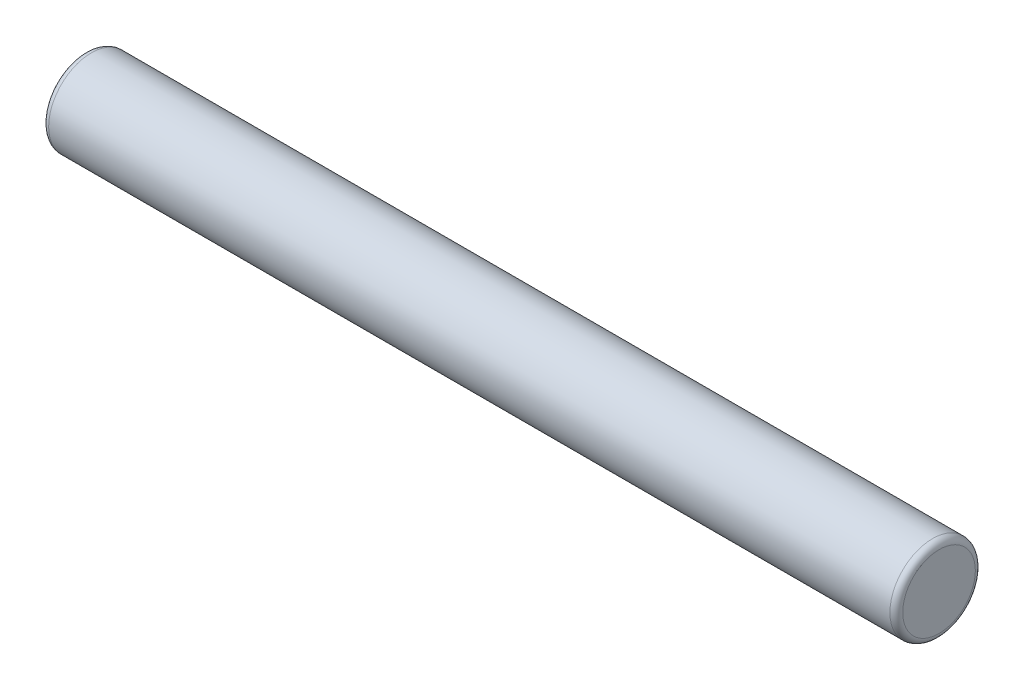
ISO-10303-21;
HEADER;
FILE_DESCRIPTION(('STEP AP214'),'2;1');
FILE_NAME('part.step','',(''),(''),'','','');
FILE_SCHEMA(('AUTOMOTIVE_DESIGN { 1 0 10303 214 1 1 1 1 }'));
ENDSEC;
DATA;
#1=APPLICATION_CONTEXT('core data for automotive mechanical design processes');
#2=APPLICATION_PROTOCOL_DEFINITION('international standard','automotive_design',2000,#1);
#3=PRODUCT_CONTEXT('',#1,'mechanical');
#4=PRODUCT('Part','Part','',(#3));
#5=PRODUCT_RELATED_PRODUCT_CATEGORY('part','',(#4));
#6=PRODUCT_DEFINITION_FORMATION('','',#4);
#7=PRODUCT_DEFINITION_CONTEXT('part definition',#1,'design');
#8=PRODUCT_DEFINITION('design','',#6,#7);
#9=PRODUCT_DEFINITION_SHAPE('','',#8);
#10=(LENGTH_UNIT() NAMED_UNIT(*) SI_UNIT(.MILLI.,.METRE.));
#11=(NAMED_UNIT(*) PLANE_ANGLE_UNIT() SI_UNIT($,.RADIAN.));
#12=(NAMED_UNIT(*) SI_UNIT($,.STERADIAN.) SOLID_ANGLE_UNIT());
#13=UNCERTAINTY_MEASURE_WITH_UNIT(LENGTH_MEASURE(1.E-05),#10,'distance_accuracy_value','');
#14=(GEOMETRIC_REPRESENTATION_CONTEXT(3) GLOBAL_UNCERTAINTY_ASSIGNED_CONTEXT((#13)) GLOBAL_UNIT_ASSIGNED_CONTEXT((#10,
#11,#12)) REPRESENTATION_CONTEXT('',''));
#15=CARTESIAN_POINT('',(0.,0.,0.));
#16=DIRECTION('',(0.,0.,1.));
#17=DIRECTION('',(1.,0.,0.));
#18=AXIS2_PLACEMENT_3D('',#15,#16,#17);
#19=CARTESIAN_POINT('',(0.,0.,0.));
#20=DIRECTION('',(-1.,0.,0.));
#21=DIRECTION('',(0.,0.,1.));
#22=AXIS2_PLACEMENT_3D('',#19,#20,#21);
#23=PLANE('',#22);
#24=CARTESIAN_POINT('',(0.,2.,0.));
#25=DIRECTION('',(-1.,0.,0.));
#26=DIRECTION('',(0.,0.,1.));
#27=AXIS2_PLACEMENT_3D('',#24,#25,#26);
#28=CIRCLE('',#27,1.7);
#29=CARTESIAN_POINT('',(0.,2.,1.7));
#30=VERTEX_POINT('',#29);
#31=EDGE_CURVE('E46',#30,#30,#28,.T.);
#32=ORIENTED_EDGE('',*,*,#31,.T.);
#33=EDGE_LOOP('',(#32));
#34=FACE_BOUND('',#33,.T.);
#35=ADVANCED_FACE('F31',(#34),#23,.T.);
#36=CARTESIAN_POINT('',(40.,0.,0.));
#37=DIRECTION('',(1.,0.,0.));
#38=DIRECTION('',(0.,0.,-1.));
#39=AXIS2_PLACEMENT_3D('',#36,#37,#38);
#40=PLANE('',#39);
#41=CARTESIAN_POINT('',(40.,2.,0.));
#42=DIRECTION('',(1.,0.,0.));
#43=DIRECTION('',(0.,0.,-1.));
#44=AXIS2_PLACEMENT_3D('',#41,#42,#43);
#45=CIRCLE('',#44,1.7);
#46=CARTESIAN_POINT('',(40.,2.,-1.7));
#47=VERTEX_POINT('',#46);
#48=EDGE_CURVE('E10',#47,#47,#45,.T.);
#49=ORIENTED_EDGE('',*,*,#48,.T.);
#50=EDGE_LOOP('',(#49));
#51=FACE_BOUND('',#50,.T.);
#52=ADVANCED_FACE('F62',(#51),#40,.T.);
#53=CARTESIAN_POINT('',(0.,2.,0.));
#54=DIRECTION('',(-1.,0.,0.));
#55=DIRECTION('',(0.,0.,1.));
#56=AXIS2_PLACEMENT_3D('',#53,#54,#55);
#57=CYLINDRICAL_SURFACE('',#56,2.);
#58=CARTESIAN_POINT('',(0.3,2.,0.));
#59=DIRECTION('',(-1.,0.,0.));
#60=DIRECTION('',(0.,0.,1.));
#61=AXIS2_PLACEMENT_3D('',#58,#59,#60);
#62=CIRCLE('',#61,2.);
#63=CARTESIAN_POINT('',(0.3,2.,2.));
#64=VERTEX_POINT('',#63);
#65=EDGE_CURVE('E38',#64,#64,#62,.F.);
#66=ORIENTED_EDGE('',*,*,#65,.T.);
#67=EDGE_LOOP('',(#66));
#68=FACE_BOUND('',#67,.T.);
#69=CARTESIAN_POINT('',(39.7,2.,0.));
#70=DIRECTION('',(1.,0.,0.));
#71=DIRECTION('',(0.,0.,-1.));
#72=AXIS2_PLACEMENT_3D('',#69,#70,#71);
#73=CIRCLE('',#72,2.);
#74=CARTESIAN_POINT('',(39.7,2.,-2.));
#75=VERTEX_POINT('',#74);
#76=EDGE_CURVE('E42',#75,#75,#73,.F.);
#77=ORIENTED_EDGE('',*,*,#76,.T.);
#78=EDGE_LOOP('',(#77));
#79=FACE_BOUND('',#78,.T.);
#80=ADVANCED_FACE('F55',(#68,#79),#57,.T.);
#81=CARTESIAN_POINT('',(0.3,2.,0.));
#82=DIRECTION('',(-1.,0.,0.));
#83=DIRECTION('',(0.,0.,1.));
#84=AXIS2_PLACEMENT_3D('',#81,#82,#83);
#85=TOROIDAL_SURFACE('',#84,1.7,0.3);
#86=ORIENTED_EDGE('',*,*,#65,.F.);
#87=EDGE_LOOP('',(#86));
#88=FACE_BOUND('',#87,.T.);
#89=ORIENTED_EDGE('',*,*,#31,.F.);
#90=EDGE_LOOP('',(#89));
#91=FACE_BOUND('',#90,.T.);
#92=ADVANCED_FACE('F53',(#88,#91),#85,.T.);
#93=CARTESIAN_POINT('',(39.7,2.,0.));
#94=DIRECTION('',(1.,0.,0.));
#95=DIRECTION('',(0.,0.,-1.));
#96=AXIS2_PLACEMENT_3D('',#93,#94,#95);
#97=TOROIDAL_SURFACE('',#96,1.7,0.3);
#98=ORIENTED_EDGE('',*,*,#48,.F.);
#99=EDGE_LOOP('',(#98));
#100=FACE_BOUND('',#99,.T.);
#101=ORIENTED_EDGE('',*,*,#76,.F.);
#102=EDGE_LOOP('',(#101));
#103=FACE_BOUND('',#102,.T.);
#104=ADVANCED_FACE('F33',(#100,#103),#97,.T.);
#105=CLOSED_SHELL('',(#35,#52,#80,#92,#104));
#106=MANIFOLD_SOLID_BREP('B2',#105);
#107=ADVANCED_BREP_SHAPE_REPRESENTATION('',(#18,#106),#14);
#108=SHAPE_DEFINITION_REPRESENTATION(#9,#107);
ENDSEC;
END-ISO-10303-21;
